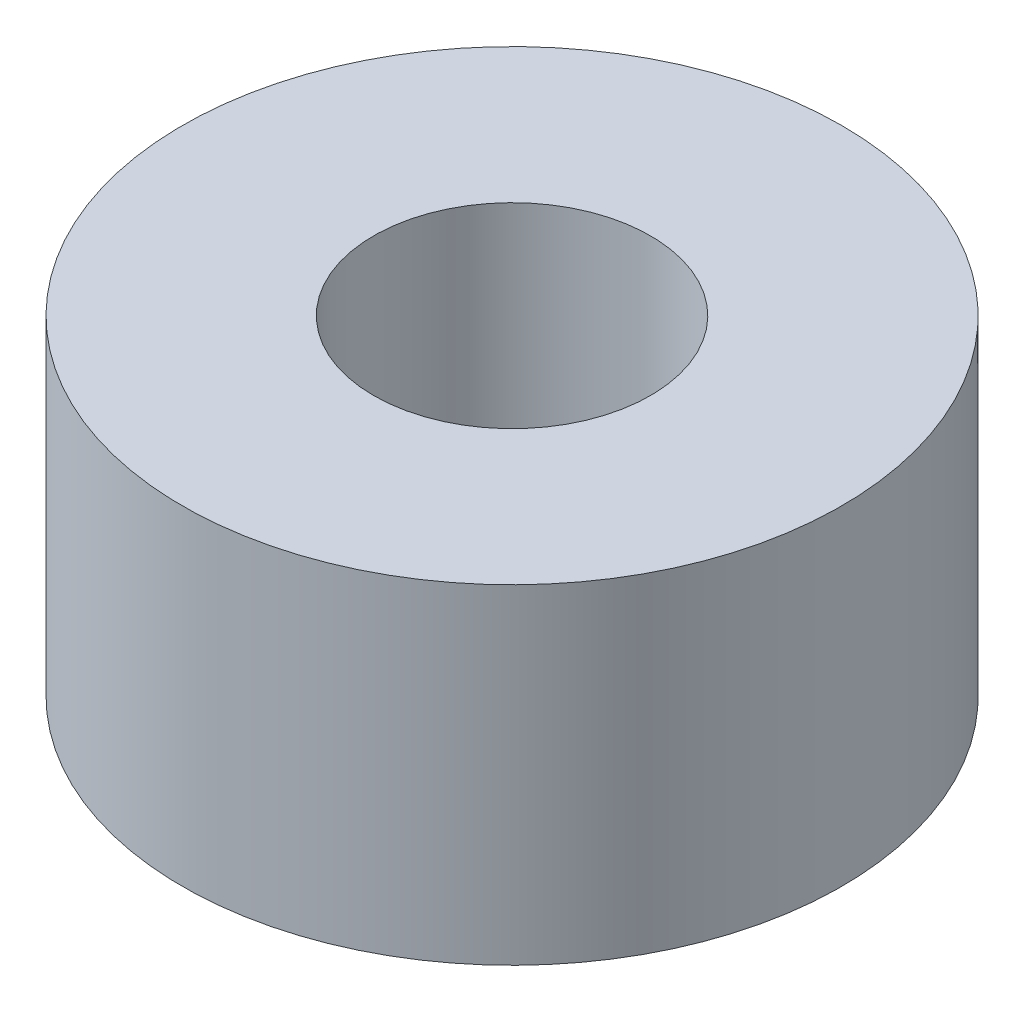
ISO-10303-21;
HEADER;
FILE_DESCRIPTION(('STEP AP214'),'2;1');
FILE_NAME('part.step','',(''),(''),'','','');
FILE_SCHEMA(('AUTOMOTIVE_DESIGN { 1 0 10303 214 1 1 1 1 }'));
ENDSEC;
DATA;
#1=APPLICATION_CONTEXT('core data for automotive mechanical design processes');
#2=APPLICATION_PROTOCOL_DEFINITION('international standard','automotive_design',2000,#1);
#3=PRODUCT_CONTEXT('',#1,'mechanical');
#4=PRODUCT('Part','Part','',(#3));
#5=PRODUCT_RELATED_PRODUCT_CATEGORY('part','',(#4));
#6=PRODUCT_DEFINITION_FORMATION('','',#4);
#7=PRODUCT_DEFINITION_CONTEXT('part definition',#1,'design');
#8=PRODUCT_DEFINITION('design','',#6,#7);
#9=PRODUCT_DEFINITION_SHAPE('','',#8);
#10=(LENGTH_UNIT() NAMED_UNIT(*) SI_UNIT(.MILLI.,.METRE.));
#11=(NAMED_UNIT(*) PLANE_ANGLE_UNIT() SI_UNIT($,.RADIAN.));
#12=(NAMED_UNIT(*) SI_UNIT($,.STERADIAN.) SOLID_ANGLE_UNIT());
#13=UNCERTAINTY_MEASURE_WITH_UNIT(LENGTH_MEASURE(1.E-05),#10,'distance_accuracy_value','');
#14=(GEOMETRIC_REPRESENTATION_CONTEXT(3) GLOBAL_UNCERTAINTY_ASSIGNED_CONTEXT((#13)) GLOBAL_UNIT_ASSIGNED_CONTEXT((#10,
#11,#12)) REPRESENTATION_CONTEXT('',''));
#15=CARTESIAN_POINT('',(0.,0.,0.));
#16=DIRECTION('',(0.,0.,1.));
#17=DIRECTION('',(1.,0.,0.));
#18=AXIS2_PLACEMENT_3D('',#15,#16,#17);
#19=CARTESIAN_POINT('',(0.,0.,0.));
#20=DIRECTION('',(0.,-1.,0.));
#21=DIRECTION('',(0.,0.,-1.));
#22=AXIS2_PLACEMENT_3D('',#19,#20,#21);
#23=PLANE('',#22);
#24=CARTESIAN_POINT('',(0.,0.,0.));
#25=DIRECTION('',(0.,1.,0.));
#26=DIRECTION('',(0.,0.,1.));
#27=AXIS2_PLACEMENT_3D('',#24,#25,#26);
#28=CIRCLE('',#27,6.3);
#29=CARTESIAN_POINT('',(0.,0.,6.3));
#30=VERTEX_POINT('',#29);
#31=EDGE_CURVE('E47',#30,#30,#28,.T.);
#32=ORIENTED_EDGE('',*,*,#31,.T.);
#33=EDGE_LOOP('',(#32));
#34=FACE_BOUND('',#33,.T.);
#35=CARTESIAN_POINT('',(0.,0.,0.));
#36=DIRECTION('',(0.,-1.,0.));
#37=DIRECTION('',(0.,0.,-1.));
#38=AXIS2_PLACEMENT_3D('',#35,#36,#37);
#39=CIRCLE('',#38,15.);
#40=CARTESIAN_POINT('',(0.,0.,-15.));
#41=VERTEX_POINT('',#40);
#42=EDGE_CURVE('E10',#41,#41,#39,.T.);
#43=ORIENTED_EDGE('',*,*,#42,.T.);
#44=EDGE_LOOP('',(#43));
#45=FACE_BOUND('',#44,.T.);
#46=ADVANCED_FACE('F37',(#34,#45),#23,.T.);
#47=CARTESIAN_POINT('',(0.,0.,0.));
#48=DIRECTION('',(0.,-1.,0.));
#49=DIRECTION('',(0.,0.,-1.));
#50=AXIS2_PLACEMENT_3D('',#47,#48,#49);
#51=CYLINDRICAL_SURFACE('',#50,15.);
#52=CARTESIAN_POINT('',(0.,15.,0.));
#53=DIRECTION('',(0.,-1.,0.));
#54=DIRECTION('',(0.,0.,-1.));
#55=AXIS2_PLACEMENT_3D('',#52,#53,#54);
#56=CIRCLE('',#55,15.);
#57=CARTESIAN_POINT('',(0.,15.,-15.));
#58=VERTEX_POINT('',#57);
#59=EDGE_CURVE('E43',#58,#58,#56,.T.);
#60=ORIENTED_EDGE('',*,*,#59,.T.);
#61=EDGE_LOOP('',(#60));
#62=FACE_BOUND('',#61,.T.);
#63=ORIENTED_EDGE('',*,*,#42,.F.);
#64=EDGE_LOOP('',(#63));
#65=FACE_BOUND('',#64,.T.);
#66=ADVANCED_FACE('F62',(#62,#65),#51,.T.);
#67=CARTESIAN_POINT('',(15.,15.,0.));
#68=DIRECTION('',(0.,1.,0.));
#69=DIRECTION('',(0.,0.,1.));
#70=AXIS2_PLACEMENT_3D('',#67,#68,#69);
#71=PLANE('',#70);
#72=CARTESIAN_POINT('',(0.,15.,0.));
#73=DIRECTION('',(0.,1.,0.));
#74=DIRECTION('',(0.,0.,1.));
#75=AXIS2_PLACEMENT_3D('',#72,#73,#74);
#76=CIRCLE('',#75,6.3);
#77=CARTESIAN_POINT('',(0.,15.,6.3));
#78=VERTEX_POINT('',#77);
#79=EDGE_CURVE('E51',#78,#78,#76,.T.);
#80=ORIENTED_EDGE('',*,*,#79,.F.);
#81=EDGE_LOOP('',(#80));
#82=FACE_BOUND('',#81,.T.);
#83=ORIENTED_EDGE('',*,*,#59,.F.);
#84=EDGE_LOOP('',(#83));
#85=FACE_BOUND('',#84,.T.);
#86=ADVANCED_FACE('F59',(#82,#85),#71,.T.);
#87=CARTESIAN_POINT('',(0.,0.,0.));
#88=DIRECTION('',(0.,1.,0.));
#89=DIRECTION('',(0.,0.,1.));
#90=AXIS2_PLACEMENT_3D('',#87,#88,#89);
#91=CYLINDRICAL_SURFACE('',#90,6.3);
#92=ORIENTED_EDGE('',*,*,#31,.F.);
#93=EDGE_LOOP('',(#92));
#94=FACE_BOUND('',#93,.T.);
#95=ORIENTED_EDGE('',*,*,#79,.T.);
#96=EDGE_LOOP('',(#95));
#97=FACE_BOUND('',#96,.T.);
#98=ADVANCED_FACE('F57',(#94,#97),#91,.F.);
#99=CLOSED_SHELL('',(#46,#66,#86,#98));
#100=MANIFOLD_SOLID_BREP('B2',#99);
#101=ADVANCED_BREP_SHAPE_REPRESENTATION('',(#18,#100),#14);
#102=SHAPE_DEFINITION_REPRESENTATION(#9,#101);
ENDSEC;
END-ISO-10303-21;
